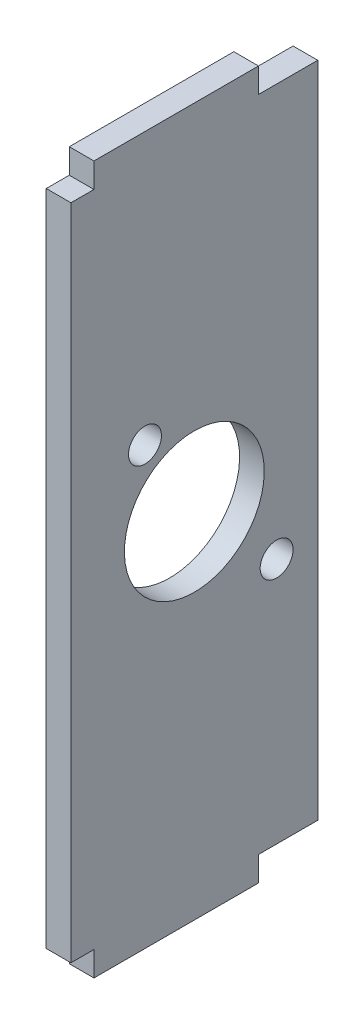
ISO-10303-21;
HEADER;
FILE_DESCRIPTION(('STEP AP214'),'2;1');
FILE_NAME('part.step','',(''),(''),'','','');
FILE_SCHEMA(('AUTOMOTIVE_DESIGN { 1 0 10303 214 1 1 1 1 }'));
ENDSEC;
DATA;
#1=APPLICATION_CONTEXT('core data for automotive mechanical design processes');
#2=APPLICATION_PROTOCOL_DEFINITION('international standard','automotive_design',2000,#1);
#3=PRODUCT_CONTEXT('',#1,'mechanical');
#4=PRODUCT('Part','Part','',(#3));
#5=PRODUCT_RELATED_PRODUCT_CATEGORY('part','',(#4));
#6=PRODUCT_DEFINITION_FORMATION('','',#4);
#7=PRODUCT_DEFINITION_CONTEXT('part definition',#1,'design');
#8=PRODUCT_DEFINITION('design','',#6,#7);
#9=PRODUCT_DEFINITION_SHAPE('','',#8);
#10=(LENGTH_UNIT() NAMED_UNIT(*) SI_UNIT(.MILLI.,.METRE.));
#11=(NAMED_UNIT(*) PLANE_ANGLE_UNIT() SI_UNIT($,.RADIAN.));
#12=(NAMED_UNIT(*) SI_UNIT($,.STERADIAN.) SOLID_ANGLE_UNIT());
#13=UNCERTAINTY_MEASURE_WITH_UNIT(LENGTH_MEASURE(1.E-05),#10,'distance_accuracy_value','');
#14=(GEOMETRIC_REPRESENTATION_CONTEXT(3) GLOBAL_UNCERTAINTY_ASSIGNED_CONTEXT((#13)) GLOBAL_UNIT_ASSIGNED_CONTEXT((#10,
#11,#12)) REPRESENTATION_CONTEXT('',''));
#15=CARTESIAN_POINT('',(0.,0.,0.));
#16=DIRECTION('',(0.,0.,1.));
#17=DIRECTION('',(1.,0.,0.));
#18=AXIS2_PLACEMENT_3D('',#15,#16,#17);
#19=CARTESIAN_POINT('',(-3.,-40.,15.));
#20=DIRECTION('',(0.,0.,-1.));
#21=DIRECTION('',(-1.,0.,0.));
#22=AXIS2_PLACEMENT_3D('',#19,#20,#21);
#23=PLANE('',#22);
#24=DIRECTION('',(0.,1.,0.));
#25=VECTOR('',#24,1.);
#26=CARTESIAN_POINT('',(0.,-40.,15.));
#27=LINE('',#26,#25);
#28=CARTESIAN_POINT('',(0.,-40.,15.));
#29=VERTEX_POINT('',#28);
#30=CARTESIAN_POINT('',(0.,40.,15.));
#31=VERTEX_POINT('',#30);
#32=EDGE_CURVE('E152',#29,#31,#27,.T.);
#33=ORIENTED_EDGE('',*,*,#32,.T.);
#34=DIRECTION('',(1.,0.,0.));
#35=VECTOR('',#34,1.);
#36=CARTESIAN_POINT('',(-3.,40.,15.));
#37=LINE('',#36,#35);
#38=CARTESIAN_POINT('',(-3.,40.,15.));
#39=VERTEX_POINT('',#38);
#40=EDGE_CURVE('E10',#39,#31,#37,.T.);
#41=ORIENTED_EDGE('',*,*,#40,.F.);
#42=DIRECTION('',(0.,1.,0.));
#43=VECTOR('',#42,1.);
#44=CARTESIAN_POINT('',(-3.,-40.,15.));
#45=LINE('',#44,#43);
#46=CARTESIAN_POINT('',(-3.,-40.,15.));
#47=VERTEX_POINT('',#46);
#48=EDGE_CURVE('E136',#47,#39,#45,.T.);
#49=ORIENTED_EDGE('',*,*,#48,.F.);
#50=DIRECTION('',(1.,0.,0.));
#51=VECTOR('',#50,1.);
#52=CARTESIAN_POINT('',(-3.,-40.,15.));
#53=LINE('',#52,#51);
#54=EDGE_CURVE('E147',#47,#29,#53,.T.);
#55=ORIENTED_EDGE('',*,*,#54,.T.);
#56=EDGE_LOOP('',(#33,#41,#49,#55));
#57=FACE_BOUND('',#56,.T.);
#58=ADVANCED_FACE('F16',(#57),#23,.F.);
#59=CARTESIAN_POINT('',(-3.,40.,15.));
#60=DIRECTION('',(0.,-1.,0.));
#61=DIRECTION('',(0.,0.,-1.));
#62=AXIS2_PLACEMENT_3D('',#59,#60,#61);
#63=PLANE('',#62);
#64=DIRECTION('',(0.,0.,-1.));
#65=VECTOR('',#64,1.);
#66=CARTESIAN_POINT('',(0.,40.,15.));
#67=LINE('',#66,#65);
#68=CARTESIAN_POINT('',(0.,40.,12.2));
#69=VERTEX_POINT('',#68);
#70=EDGE_CURVE('E148',#31,#69,#67,.T.);
#71=ORIENTED_EDGE('',*,*,#70,.T.);
#72=DIRECTION('',(1.,0.,0.));
#73=VECTOR('',#72,1.);
#74=CARTESIAN_POINT('',(-3.,40.,12.2));
#75=LINE('',#74,#73);
#76=CARTESIAN_POINT('',(-3.,40.,12.2));
#77=VERTEX_POINT('',#76);
#78=EDGE_CURVE('E24',#77,#69,#75,.T.);
#79=ORIENTED_EDGE('',*,*,#78,.F.);
#80=DIRECTION('',(0.,0.,-1.));
#81=VECTOR('',#80,1.);
#82=CARTESIAN_POINT('',(-3.,40.,15.));
#83=LINE('',#82,#81);
#84=EDGE_CURVE('E87',#39,#77,#83,.T.);
#85=ORIENTED_EDGE('',*,*,#84,.F.);
#86=ORIENTED_EDGE('',*,*,#40,.T.);
#87=EDGE_LOOP('',(#71,#79,#85,#86));
#88=FACE_BOUND('',#87,.T.);
#89=ADVANCED_FACE('F276',(#88),#63,.F.);
#90=CARTESIAN_POINT('',(-3.,40.,12.2));
#91=DIRECTION('',(0.,0.,-1.));
#92=DIRECTION('',(-1.,0.,0.));
#93=AXIS2_PLACEMENT_3D('',#90,#91,#92);
#94=PLANE('',#93);
#95=DIRECTION('',(0.,1.,0.));
#96=VECTOR('',#95,1.);
#97=CARTESIAN_POINT('',(0.,40.,12.2));
#98=LINE('',#97,#96);
#99=CARTESIAN_POINT('',(0.,43.,12.2));
#100=VERTEX_POINT('',#99);
#101=EDGE_CURVE('E151',#69,#100,#98,.T.);
#102=ORIENTED_EDGE('',*,*,#101,.T.);
#103=DIRECTION('',(1.,0.,0.));
#104=VECTOR('',#103,1.);
#105=CARTESIAN_POINT('',(-3.,43.,12.2));
#106=LINE('',#105,#104);
#107=CARTESIAN_POINT('',(-3.,43.,12.2));
#108=VERTEX_POINT('',#107);
#109=EDGE_CURVE('E211',#108,#100,#106,.T.);
#110=ORIENTED_EDGE('',*,*,#109,.F.);
#111=DIRECTION('',(0.,1.,0.));
#112=VECTOR('',#111,1.);
#113=CARTESIAN_POINT('',(-3.,40.,12.2));
#114=LINE('',#113,#112);
#115=EDGE_CURVE('E219',#77,#108,#114,.T.);
#116=ORIENTED_EDGE('',*,*,#115,.F.);
#117=ORIENTED_EDGE('',*,*,#78,.T.);
#118=EDGE_LOOP('',(#102,#110,#116,#117));
#119=FACE_BOUND('',#118,.T.);
#120=ADVANCED_FACE('F217',(#119),#94,.F.);
#121=CARTESIAN_POINT('',(-3.,43.,12.2));
#122=DIRECTION('',(0.,-1.,0.));
#123=DIRECTION('',(0.,0.,-1.));
#124=AXIS2_PLACEMENT_3D('',#121,#122,#123);
#125=PLANE('',#124);
#126=DIRECTION('',(0.,0.,-1.));
#127=VECTOR('',#126,1.);
#128=CARTESIAN_POINT('',(0.,43.,12.2));
#129=LINE('',#128,#127);
#130=CARTESIAN_POINT('',(0.,43.,-7.79999999999998));
#131=VERTEX_POINT('',#130);
#132=EDGE_CURVE('E155',#100,#131,#129,.T.);
#133=ORIENTED_EDGE('',*,*,#132,.T.);
#134=DIRECTION('',(1.,0.,0.));
#135=VECTOR('',#134,1.);
#136=CARTESIAN_POINT('',(-3.,43.,-7.79999999999998));
#137=LINE('',#136,#135);
#138=CARTESIAN_POINT('',(-3.,43.,-7.79999999999998));
#139=VERTEX_POINT('',#138);
#140=EDGE_CURVE('E208',#139,#131,#137,.T.);
#141=ORIENTED_EDGE('',*,*,#140,.F.);
#142=DIRECTION('',(0.,0.,-1.));
#143=VECTOR('',#142,1.);
#144=CARTESIAN_POINT('',(-3.,43.,12.2));
#145=LINE('',#144,#143);
#146=EDGE_CURVE('E237',#108,#139,#145,.T.);
#147=ORIENTED_EDGE('',*,*,#146,.F.);
#148=ORIENTED_EDGE('',*,*,#109,.T.);
#149=EDGE_LOOP('',(#133,#141,#147,#148));
#150=FACE_BOUND('',#149,.T.);
#151=ADVANCED_FACE('F228',(#150),#125,.F.);
#152=CARTESIAN_POINT('',(-3.,43.,-7.79999999999998));
#153=DIRECTION('',(0.,0.,1.));
#154=DIRECTION('',(1.,0.,0.));
#155=AXIS2_PLACEMENT_3D('',#152,#153,#154);
#156=PLANE('',#155);
#157=DIRECTION('',(0.,-1.,0.));
#158=VECTOR('',#157,1.);
#159=CARTESIAN_POINT('',(0.,43.,-7.79999999999998));
#160=LINE('',#159,#158);
#161=CARTESIAN_POINT('',(0.,40.,-7.79999999999998));
#162=VERTEX_POINT('',#161);
#163=EDGE_CURVE('E158',#131,#162,#160,.T.);
#164=ORIENTED_EDGE('',*,*,#163,.T.);
#165=DIRECTION('',(1.,0.,0.));
#166=VECTOR('',#165,1.);
#167=CARTESIAN_POINT('',(-3.,40.,-7.79999999999998));
#168=LINE('',#167,#166);
#169=CARTESIAN_POINT('',(-3.,40.,-7.79999999999998));
#170=VERTEX_POINT('',#169);
#171=EDGE_CURVE('E205',#170,#162,#168,.T.);
#172=ORIENTED_EDGE('',*,*,#171,.F.);
#173=DIRECTION('',(0.,-1.,0.));
#174=VECTOR('',#173,1.);
#175=CARTESIAN_POINT('',(-3.,43.,-7.79999999999998));
#176=LINE('',#175,#174);
#177=EDGE_CURVE('E234',#139,#170,#176,.T.);
#178=ORIENTED_EDGE('',*,*,#177,.F.);
#179=ORIENTED_EDGE('',*,*,#140,.T.);
#180=EDGE_LOOP('',(#164,#172,#178,#179));
#181=FACE_BOUND('',#180,.T.);
#182=ADVANCED_FACE('F232',(#181),#156,.F.);
#183=CARTESIAN_POINT('',(-3.,40.,-7.79999999999998));
#184=DIRECTION('',(0.,-1.,0.));
#185=DIRECTION('',(0.,0.,-1.));
#186=AXIS2_PLACEMENT_3D('',#183,#184,#185);
#187=PLANE('',#186);
#188=DIRECTION('',(0.,0.,-1.));
#189=VECTOR('',#188,1.);
#190=CARTESIAN_POINT('',(0.,40.,-7.79999999999998));
#191=LINE('',#190,#189);
#192=CARTESIAN_POINT('',(0.,40.,-15.));
#193=VERTEX_POINT('',#192);
#194=EDGE_CURVE('E161',#162,#193,#191,.T.);
#195=ORIENTED_EDGE('',*,*,#194,.T.);
#196=DIRECTION('',(1.,0.,0.));
#197=VECTOR('',#196,1.);
#198=CARTESIAN_POINT('',(-3.,40.,-15.));
#199=LINE('',#198,#197);
#200=CARTESIAN_POINT('',(-3.,40.,-15.));
#201=VERTEX_POINT('',#200);
#202=EDGE_CURVE('E202',#201,#193,#199,.T.);
#203=ORIENTED_EDGE('',*,*,#202,.F.);
#204=DIRECTION('',(0.,0.,-1.));
#205=VECTOR('',#204,1.);
#206=CARTESIAN_POINT('',(-3.,40.,-7.79999999999998));
#207=LINE('',#206,#205);
#208=EDGE_CURVE('E236',#170,#201,#207,.T.);
#209=ORIENTED_EDGE('',*,*,#208,.F.);
#210=ORIENTED_EDGE('',*,*,#171,.T.);
#211=EDGE_LOOP('',(#195,#203,#209,#210));
#212=FACE_BOUND('',#211,.T.);
#213=ADVANCED_FACE('F289',(#212),#187,.F.);
#214=CARTESIAN_POINT('',(-3.,40.,-15.));
#215=DIRECTION('',(0.,0.,1.));
#216=DIRECTION('',(0.,-1.,0.));
#217=AXIS2_PLACEMENT_3D('',#214,#215,#216);
#218=PLANE('',#217);
#219=DIRECTION('',(0.,-1.,0.));
#220=VECTOR('',#219,1.);
#221=CARTESIAN_POINT('',(0.,40.,-15.));
#222=LINE('',#221,#220);
#223=CARTESIAN_POINT('',(0.,-40.,-15.));
#224=VERTEX_POINT('',#223);
#225=EDGE_CURVE('E164',#193,#224,#222,.T.);
#226=ORIENTED_EDGE('',*,*,#225,.T.);
#227=DIRECTION('',(1.,0.,0.));
#228=VECTOR('',#227,1.);
#229=CARTESIAN_POINT('',(-3.,-40.,-15.));
#230=LINE('',#229,#228);
#231=CARTESIAN_POINT('',(-3.,-40.,-15.));
#232=VERTEX_POINT('',#231);
#233=EDGE_CURVE('E199',#232,#224,#230,.T.);
#234=ORIENTED_EDGE('',*,*,#233,.F.);
#235=DIRECTION('',(0.,-1.,0.));
#236=VECTOR('',#235,1.);
#237=CARTESIAN_POINT('',(-3.,40.,-15.));
#238=LINE('',#237,#236);
#239=EDGE_CURVE('E239',#201,#232,#238,.T.);
#240=ORIENTED_EDGE('',*,*,#239,.F.);
#241=ORIENTED_EDGE('',*,*,#202,.T.);
#242=EDGE_LOOP('',(#226,#234,#240,#241));
#243=FACE_BOUND('',#242,.T.);
#244=ADVANCED_FACE('F292',(#243),#218,.F.);
#245=CARTESIAN_POINT('',(-3.,-40.,-15.));
#246=DIRECTION('',(0.,1.,0.));
#247=DIRECTION('',(0.,0.,1.));
#248=AXIS2_PLACEMENT_3D('',#245,#246,#247);
#249=PLANE('',#248);
#250=DIRECTION('',(0.,0.,1.));
#251=VECTOR('',#250,1.);
#252=CARTESIAN_POINT('',(0.,-40.,-15.));
#253=LINE('',#252,#251);
#254=CARTESIAN_POINT('',(0.,-40.,-7.79999999999999));
#255=VERTEX_POINT('',#254);
#256=EDGE_CURVE('E167',#224,#255,#253,.T.);
#257=ORIENTED_EDGE('',*,*,#256,.T.);
#258=DIRECTION('',(1.,0.,0.));
#259=VECTOR('',#258,1.);
#260=CARTESIAN_POINT('',(-3.,-40.,-7.79999999999999));
#261=LINE('',#260,#259);
#262=CARTESIAN_POINT('',(-3.,-40.,-7.79999999999999));
#263=VERTEX_POINT('',#262);
#264=EDGE_CURVE('E196',#263,#255,#261,.T.);
#265=ORIENTED_EDGE('',*,*,#264,.F.);
#266=DIRECTION('',(0.,0.,1.));
#267=VECTOR('',#266,1.);
#268=CARTESIAN_POINT('',(-3.,-40.,-15.));
#269=LINE('',#268,#267);
#270=EDGE_CURVE('E245',#232,#263,#269,.T.);
#271=ORIENTED_EDGE('',*,*,#270,.F.);
#272=ORIENTED_EDGE('',*,*,#233,.T.);
#273=EDGE_LOOP('',(#257,#265,#271,#272));
#274=FACE_BOUND('',#273,.T.);
#275=ADVANCED_FACE('F251',(#274),#249,.F.);
#276=CARTESIAN_POINT('',(-3.,-40.,-7.79999999999999));
#277=DIRECTION('',(0.,0.,1.));
#278=DIRECTION('',(1.,0.,0.));
#279=AXIS2_PLACEMENT_3D('',#276,#277,#278);
#280=PLANE('',#279);
#281=DIRECTION('',(0.,-1.,0.));
#282=VECTOR('',#281,1.);
#283=CARTESIAN_POINT('',(0.,-40.,-7.79999999999999));
#284=LINE('',#283,#282);
#285=CARTESIAN_POINT('',(0.,-43.,-7.79999999999999));
#286=VERTEX_POINT('',#285);
#287=EDGE_CURVE('E170',#255,#286,#284,.T.);
#288=ORIENTED_EDGE('',*,*,#287,.T.);
#289=DIRECTION('',(1.,0.,0.));
#290=VECTOR('',#289,1.);
#291=CARTESIAN_POINT('',(-3.,-43.,-7.79999999999999));
#292=LINE('',#291,#290);
#293=CARTESIAN_POINT('',(-3.,-43.,-7.79999999999999));
#294=VERTEX_POINT('',#293);
#295=EDGE_CURVE('E127',#294,#286,#292,.T.);
#296=ORIENTED_EDGE('',*,*,#295,.F.);
#297=DIRECTION('',(0.,-1.,0.));
#298=VECTOR('',#297,1.);
#299=CARTESIAN_POINT('',(-3.,-40.,-7.79999999999999));
#300=LINE('',#299,#298);
#301=EDGE_CURVE('E118',#263,#294,#300,.T.);
#302=ORIENTED_EDGE('',*,*,#301,.F.);
#303=ORIENTED_EDGE('',*,*,#264,.T.);
#304=EDGE_LOOP('',(#288,#296,#302,#303));
#305=FACE_BOUND('',#304,.T.);
#306=ADVANCED_FACE('F255',(#305),#280,.F.);
#307=CARTESIAN_POINT('',(-3.,-43.,-7.79999999999999));
#308=DIRECTION('',(0.,1.,0.));
#309=DIRECTION('',(0.,0.,1.));
#310=AXIS2_PLACEMENT_3D('',#307,#308,#309);
#311=PLANE('',#310);
#312=DIRECTION('',(0.,0.,1.));
#313=VECTOR('',#312,1.);
#314=CARTESIAN_POINT('',(0.,-43.,-7.79999999999999));
#315=LINE('',#314,#313);
#316=CARTESIAN_POINT('',(0.,-43.,12.2));
#317=VERTEX_POINT('',#316);
#318=EDGE_CURVE('E126',#286,#317,#315,.T.);
#319=ORIENTED_EDGE('',*,*,#318,.T.);
#320=DIRECTION('',(1.,0.,0.));
#321=VECTOR('',#320,1.);
#322=CARTESIAN_POINT('',(-3.,-43.,12.2));
#323=LINE('',#322,#321);
#324=CARTESIAN_POINT('',(-3.,-43.,12.2));
#325=VERTEX_POINT('',#324);
#326=EDGE_CURVE('E123',#325,#317,#323,.T.);
#327=ORIENTED_EDGE('',*,*,#326,.F.);
#328=DIRECTION('',(0.,0.,1.));
#329=VECTOR('',#328,1.);
#330=CARTESIAN_POINT('',(-3.,-43.,-7.79999999999999));
#331=LINE('',#330,#329);
#332=EDGE_CURVE('E112',#294,#325,#331,.T.);
#333=ORIENTED_EDGE('',*,*,#332,.F.);
#334=ORIENTED_EDGE('',*,*,#295,.T.);
#335=EDGE_LOOP('',(#319,#327,#333,#334));
#336=FACE_BOUND('',#335,.T.);
#337=ADVANCED_FACE('F124',(#336),#311,.F.);
#338=CARTESIAN_POINT('',(-3.,-43.,12.2));
#339=DIRECTION('',(0.,0.,-1.));
#340=DIRECTION('',(0.,1.,0.));
#341=AXIS2_PLACEMENT_3D('',#338,#339,#340);
#342=PLANE('',#341);
#343=DIRECTION('',(0.,1.,0.));
#344=VECTOR('',#343,1.);
#345=CARTESIAN_POINT('',(0.,-43.,12.2));
#346=LINE('',#345,#344);
#347=CARTESIAN_POINT('',(0.,-40.,12.2));
#348=VERTEX_POINT('',#347);
#349=EDGE_CURVE('E73',#317,#348,#346,.T.);
#350=ORIENTED_EDGE('',*,*,#349,.T.);
#351=DIRECTION('',(1.,0.,0.));
#352=VECTOR('',#351,1.);
#353=CARTESIAN_POINT('',(-3.,-40.,12.2));
#354=LINE('',#353,#352);
#355=CARTESIAN_POINT('',(-3.,-40.,12.2));
#356=VERTEX_POINT('',#355);
#357=EDGE_CURVE('E128',#356,#348,#354,.T.);
#358=ORIENTED_EDGE('',*,*,#357,.F.);
#359=DIRECTION('',(0.,1.,0.));
#360=VECTOR('',#359,1.);
#361=CARTESIAN_POINT('',(-3.,-43.,12.2));
#362=LINE('',#361,#360);
#363=EDGE_CURVE('E116',#325,#356,#362,.T.);
#364=ORIENTED_EDGE('',*,*,#363,.F.);
#365=ORIENTED_EDGE('',*,*,#326,.T.);
#366=EDGE_LOOP('',(#350,#358,#364,#365));
#367=FACE_BOUND('',#366,.T.);
#368=ADVANCED_FACE('F130',(#367),#342,.F.);
#369=CARTESIAN_POINT('',(-3.,0.,0.));
#370=DIRECTION('',(1.,0.,0.));
#371=DIRECTION('',(0.,0.,-1.));
#372=AXIS2_PLACEMENT_3D('',#369,#370,#371);
#373=CYLINDRICAL_SURFACE('',#372,8.5);
#374=CARTESIAN_POINT('',(-3.,0.,0.));
#375=DIRECTION('',(-1.,0.,0.));
#376=DIRECTION('',(0.,1.,0.));
#377=AXIS2_PLACEMENT_3D('',#374,#375,#376);
#378=CIRCLE('',#377,8.5);
#379=CARTESIAN_POINT('',(-3.,8.5,0.));
#380=VERTEX_POINT('',#379);
#381=EDGE_CURVE('E132',#380,#380,#378,.T.);
#382=ORIENTED_EDGE('',*,*,#381,.T.);
#383=EDGE_LOOP('',(#382));
#384=FACE_BOUND('',#383,.T.);
#385=CARTESIAN_POINT('',(0.,0.,0.));
#386=DIRECTION('',(-1.,0.,0.));
#387=DIRECTION('',(0.,1.,0.));
#388=AXIS2_PLACEMENT_3D('',#385,#386,#387);
#389=CIRCLE('',#388,8.5);
#390=CARTESIAN_POINT('',(0.,8.5,0.));
#391=VERTEX_POINT('',#390);
#392=EDGE_CURVE('E179',#391,#391,#389,.T.);
#393=ORIENTED_EDGE('',*,*,#392,.F.);
#394=EDGE_LOOP('',(#393));
#395=FACE_BOUND('',#394,.T.);
#396=ADVANCED_FACE('F303',(#384,#395),#373,.F.);
#397=CARTESIAN_POINT('',(-3.,10.,6.00000000000002));
#398=DIRECTION('',(1.,0.,0.));
#399=DIRECTION('',(0.,0.,-1.));
#400=AXIS2_PLACEMENT_3D('',#397,#398,#399);
#401=CYLINDRICAL_SURFACE('',#400,2.);
#402=CARTESIAN_POINT('',(-3.,10.,6.00000000000002));
#403=DIRECTION('',(-1.,0.,0.));
#404=DIRECTION('',(0.,1.,0.));
#405=AXIS2_PLACEMENT_3D('',#402,#403,#404);
#406=CIRCLE('',#405,2.);
#407=CARTESIAN_POINT('',(-3.,12.,6.00000000000002));
#408=VERTEX_POINT('',#407);
#409=EDGE_CURVE('E141',#408,#408,#406,.T.);
#410=ORIENTED_EDGE('',*,*,#409,.T.);
#411=EDGE_LOOP('',(#410));
#412=FACE_BOUND('',#411,.T.);
#413=CARTESIAN_POINT('',(0.,10.,6.00000000000002));
#414=DIRECTION('',(-1.,0.,0.));
#415=DIRECTION('',(0.,1.,0.));
#416=AXIS2_PLACEMENT_3D('',#413,#414,#415);
#417=CIRCLE('',#416,2.);
#418=CARTESIAN_POINT('',(0.,12.,6.00000000000002));
#419=VERTEX_POINT('',#418);
#420=EDGE_CURVE('E186',#419,#419,#417,.T.);
#421=ORIENTED_EDGE('',*,*,#420,.F.);
#422=EDGE_LOOP('',(#421));
#423=FACE_BOUND('',#422,.T.);
#424=ADVANCED_FACE('F270',(#412,#423),#401,.F.);
#425=CARTESIAN_POINT('',(-3.,-10.,-9.99999999999999));
#426=DIRECTION('',(1.,0.,0.));
#427=DIRECTION('',(0.,0.,-1.));
#428=AXIS2_PLACEMENT_3D('',#425,#426,#427);
#429=CYLINDRICAL_SURFACE('',#428,2.);
#430=CARTESIAN_POINT('',(-3.,-10.,-9.99999999999999));
#431=DIRECTION('',(-1.,0.,0.));
#432=DIRECTION('',(0.,1.,0.));
#433=AXIS2_PLACEMENT_3D('',#430,#431,#432);
#434=CIRCLE('',#433,2.);
#435=CARTESIAN_POINT('',(-3.,-8.,-9.99999999999999));
#436=VERTEX_POINT('',#435);
#437=EDGE_CURVE('E144',#436,#436,#434,.T.);
#438=ORIENTED_EDGE('',*,*,#437,.T.);
#439=EDGE_LOOP('',(#438));
#440=FACE_BOUND('',#439,.T.);
#441=CARTESIAN_POINT('',(0.,-10.,-9.99999999999999));
#442=DIRECTION('',(-1.,0.,0.));
#443=DIRECTION('',(0.,1.,0.));
#444=AXIS2_PLACEMENT_3D('',#441,#442,#443);
#445=CIRCLE('',#444,2.);
#446=CARTESIAN_POINT('',(0.,-8.,-9.99999999999999));
#447=VERTEX_POINT('',#446);
#448=EDGE_CURVE('E138',#447,#447,#445,.T.);
#449=ORIENTED_EDGE('',*,*,#448,.F.);
#450=EDGE_LOOP('',(#449));
#451=FACE_BOUND('',#450,.T.);
#452=ADVANCED_FACE('F261',(#440,#451),#429,.F.);
#453=CARTESIAN_POINT('',(-3.,-40.,12.2));
#454=DIRECTION('',(0.,1.,0.));
#455=DIRECTION('',(0.,0.,1.));
#456=AXIS2_PLACEMENT_3D('',#453,#454,#455);
#457=PLANE('',#456);
#458=DIRECTION('',(0.,0.,1.));
#459=VECTOR('',#458,1.);
#460=CARTESIAN_POINT('',(0.,-40.,12.2));
#461=LINE('',#460,#459);
#462=EDGE_CURVE('E79',#348,#29,#461,.T.);
#463=ORIENTED_EDGE('',*,*,#462,.T.);
#464=ORIENTED_EDGE('',*,*,#54,.F.);
#465=DIRECTION('',(0.,0.,1.));
#466=VECTOR('',#465,1.);
#467=CARTESIAN_POINT('',(-3.,-40.,12.2));
#468=LINE('',#467,#466);
#469=EDGE_CURVE('E32',#356,#47,#468,.T.);
#470=ORIENTED_EDGE('',*,*,#469,.F.);
#471=ORIENTED_EDGE('',*,*,#357,.T.);
#472=EDGE_LOOP('',(#463,#464,#470,#471));
#473=FACE_BOUND('',#472,.T.);
#474=ADVANCED_FACE('F259',(#473),#457,.F.);
#475=CARTESIAN_POINT('',(-3.,0.,0.));
#476=DIRECTION('',(-1.,0.,0.));
#477=DIRECTION('',(0.,-1.,0.));
#478=AXIS2_PLACEMENT_3D('',#475,#476,#477);
#479=PLANE('',#478);
#480=ORIENTED_EDGE('',*,*,#437,.F.);
#481=EDGE_LOOP('',(#480));
#482=FACE_BOUND('',#481,.T.);
#483=ORIENTED_EDGE('',*,*,#409,.F.);
#484=EDGE_LOOP('',(#483));
#485=FACE_BOUND('',#484,.T.);
#486=ORIENTED_EDGE('',*,*,#381,.F.);
#487=EDGE_LOOP('',(#486));
#488=FACE_BOUND('',#487,.T.);
#489=ORIENTED_EDGE('',*,*,#48,.T.);
#490=ORIENTED_EDGE('',*,*,#84,.T.);
#491=ORIENTED_EDGE('',*,*,#115,.T.);
#492=ORIENTED_EDGE('',*,*,#146,.T.);
#493=ORIENTED_EDGE('',*,*,#177,.T.);
#494=ORIENTED_EDGE('',*,*,#208,.T.);
#495=ORIENTED_EDGE('',*,*,#239,.T.);
#496=ORIENTED_EDGE('',*,*,#270,.T.);
#497=ORIENTED_EDGE('',*,*,#301,.T.);
#498=ORIENTED_EDGE('',*,*,#332,.T.);
#499=ORIENTED_EDGE('',*,*,#363,.T.);
#500=ORIENTED_EDGE('',*,*,#469,.T.);
#501=EDGE_LOOP('',(#489,#490,#491,#492,#493,#494,#495,#496,#497,#498,#499,#500));
#502=FACE_BOUND('',#501,.T.);
#503=ADVANCED_FACE('F114',(#482,#485,#488,#502),#479,.T.);
#504=CARTESIAN_POINT('',(0.,0.,0.));
#505=DIRECTION('',(-1.,0.,0.));
#506=DIRECTION('',(0.,-1.,0.));
#507=AXIS2_PLACEMENT_3D('',#504,#505,#506);
#508=PLANE('',#507);
#509=ORIENTED_EDGE('',*,*,#448,.T.);
#510=EDGE_LOOP('',(#509));
#511=FACE_BOUND('',#510,.T.);
#512=ORIENTED_EDGE('',*,*,#420,.T.);
#513=EDGE_LOOP('',(#512));
#514=FACE_BOUND('',#513,.T.);
#515=ORIENTED_EDGE('',*,*,#392,.T.);
#516=EDGE_LOOP('',(#515));
#517=FACE_BOUND('',#516,.T.);
#518=ORIENTED_EDGE('',*,*,#32,.F.);
#519=ORIENTED_EDGE('',*,*,#462,.F.);
#520=ORIENTED_EDGE('',*,*,#349,.F.);
#521=ORIENTED_EDGE('',*,*,#318,.F.);
#522=ORIENTED_EDGE('',*,*,#287,.F.);
#523=ORIENTED_EDGE('',*,*,#256,.F.);
#524=ORIENTED_EDGE('',*,*,#225,.F.);
#525=ORIENTED_EDGE('',*,*,#194,.F.);
#526=ORIENTED_EDGE('',*,*,#163,.F.);
#527=ORIENTED_EDGE('',*,*,#132,.F.);
#528=ORIENTED_EDGE('',*,*,#101,.F.);
#529=ORIENTED_EDGE('',*,*,#70,.F.);
#530=EDGE_LOOP('',(#518,#519,#520,#521,#522,#523,#524,#525,#526,#527,#528,#529));
#531=FACE_BOUND('',#530,.T.);
#532=ADVANCED_FACE('F223',(#511,#514,#517,#531),#508,.F.);
#533=CLOSED_SHELL('',(#58,#89,#120,#151,#182,#213,#244,#275,#306,#337,#368,#396,#424,#452,#474,
#503,#532));
#534=MANIFOLD_SOLID_BREP('B1',#533);
#535=ADVANCED_BREP_SHAPE_REPRESENTATION('',(#18,#534),#14);
#536=SHAPE_DEFINITION_REPRESENTATION(#9,#535);
ENDSEC;
END-ISO-10303-21;
